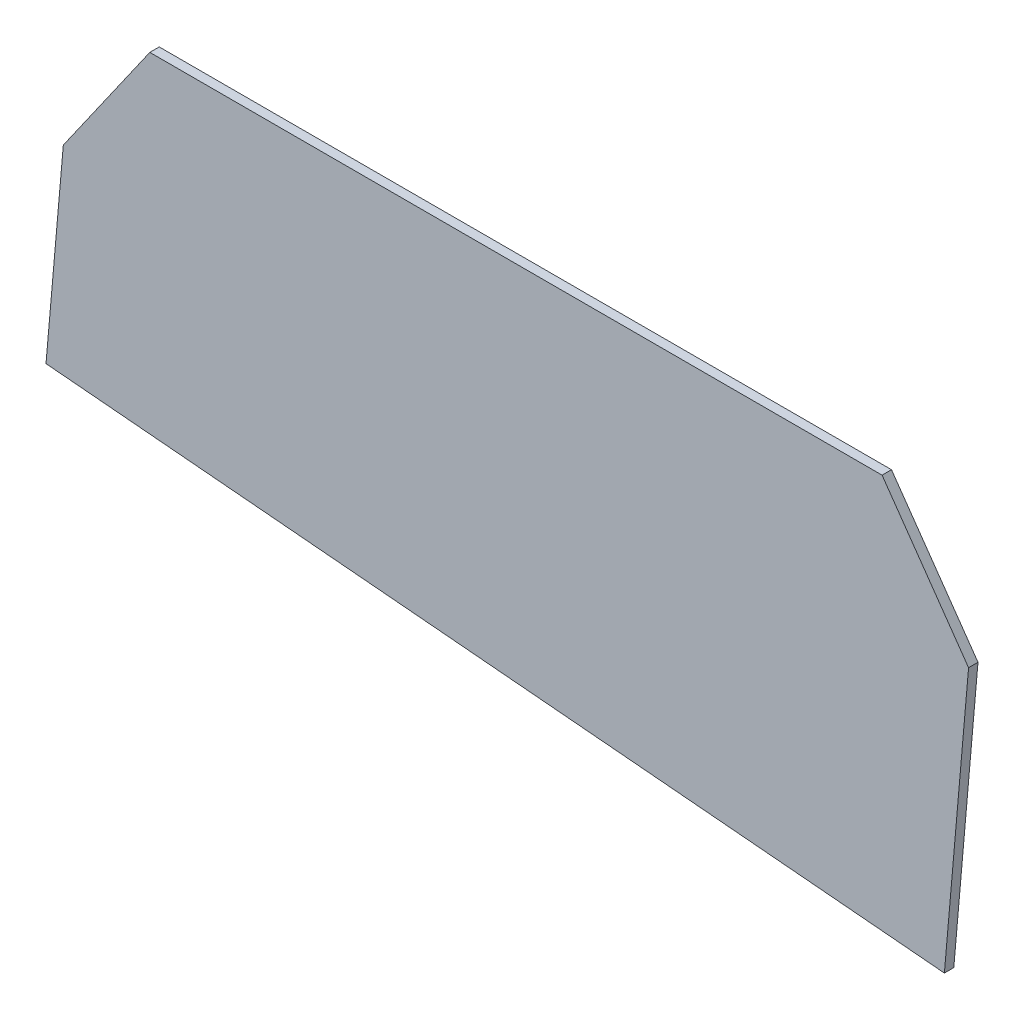
ISO-10303-21;
HEADER;
FILE_DESCRIPTION(('STEP AP214'),'2;1');
FILE_NAME('part.step','',(''),(''),'','','');
FILE_SCHEMA(('AUTOMOTIVE_DESIGN { 1 0 10303 214 1 1 1 1 }'));
ENDSEC;
DATA;
#1=APPLICATION_CONTEXT('core data for automotive mechanical design processes');
#2=APPLICATION_PROTOCOL_DEFINITION('international standard','automotive_design',2000,#1);
#3=PRODUCT_CONTEXT('',#1,'mechanical');
#4=PRODUCT('Part','Part','',(#3));
#5=PRODUCT_RELATED_PRODUCT_CATEGORY('part','',(#4));
#6=PRODUCT_DEFINITION_FORMATION('','',#4);
#7=PRODUCT_DEFINITION_CONTEXT('part definition',#1,'design');
#8=PRODUCT_DEFINITION('design','',#6,#7);
#9=PRODUCT_DEFINITION_SHAPE('','',#8);
#10=(LENGTH_UNIT() NAMED_UNIT(*) SI_UNIT(.MILLI.,.METRE.));
#11=(NAMED_UNIT(*) PLANE_ANGLE_UNIT() SI_UNIT($,.RADIAN.));
#12=(NAMED_UNIT(*) SI_UNIT($,.STERADIAN.) SOLID_ANGLE_UNIT());
#13=UNCERTAINTY_MEASURE_WITH_UNIT(LENGTH_MEASURE(1.E-05),#10,'distance_accuracy_value','');
#14=(GEOMETRIC_REPRESENTATION_CONTEXT(3) GLOBAL_UNCERTAINTY_ASSIGNED_CONTEXT((#13)) GLOBAL_UNIT_ASSIGNED_CONTEXT((#10,
#11,#12)) REPRESENTATION_CONTEXT('',''));
#15=CARTESIAN_POINT('',(0.,0.,0.));
#16=DIRECTION('',(0.,0.,1.));
#17=DIRECTION('',(1.,0.,0.));
#18=AXIS2_PLACEMENT_3D('',#15,#16,#17);
#19=CARTESIAN_POINT('',(-79.8500812574928,25.4000000000057,3.175));
#20=DIRECTION('',(0.,-1.,0.));
#21=DIRECTION('',(1.,0.,0.));
#22=AXIS2_PLACEMENT_3D('',#19,#20,#21);
#23=PLANE('',#22);
#24=DIRECTION('',(-1.,0.,0.));
#25=VECTOR('',#24,1.);
#26=CARTESIAN_POINT('',(-79.8500812574928,25.4000000000057,0.));
#27=LINE('',#26,#25);
#28=CARTESIAN_POINT('',(-79.8500812574928,25.4000000000057,0.));
#29=VERTEX_POINT('',#28);
#30=CARTESIAN_POINT('',(-326.549918742491,25.4000000000047,0.));
#31=VERTEX_POINT('',#30);
#32=EDGE_CURVE('E131',#29,#31,#27,.T.);
#33=ORIENTED_EDGE('',*,*,#32,.T.);
#34=DIRECTION('',(0.,0.,-1.));
#35=VECTOR('',#34,1.);
#36=CARTESIAN_POINT('',(-326.549918742491,25.4000000000047,3.175));
#37=LINE('',#36,#35);
#38=CARTESIAN_POINT('',(-326.549918742491,25.4000000000047,3.175));
#39=VERTEX_POINT('',#38);
#40=EDGE_CURVE('E11',#39,#31,#37,.T.);
#41=ORIENTED_EDGE('',*,*,#40,.F.);
#42=DIRECTION('',(-1.,0.,0.));
#43=VECTOR('',#42,1.);
#44=CARTESIAN_POINT('',(-79.8500812574928,25.4000000000057,3.175));
#45=LINE('',#44,#43);
#46=CARTESIAN_POINT('',(-79.8500812574928,25.4000000000057,3.175));
#47=VERTEX_POINT('',#46);
#48=EDGE_CURVE('E145',#47,#39,#45,.T.);
#49=ORIENTED_EDGE('',*,*,#48,.F.);
#50=DIRECTION('',(0.,0.,-1.));
#51=VECTOR('',#50,1.);
#52=CARTESIAN_POINT('',(-79.8500812574928,25.4000000000057,3.175));
#53=LINE('',#52,#51);
#54=EDGE_CURVE('E127',#47,#29,#53,.T.);
#55=ORIENTED_EDGE('',*,*,#54,.T.);
#56=EDGE_LOOP('',(#33,#41,#49,#55));
#57=FACE_BOUND('',#56,.T.);
#58=ADVANCED_FACE('F39',(#57),#23,.F.);
#59=CARTESIAN_POINT('',(-326.549918742491,25.4000000000047,3.175));
#60=DIRECTION('',(0.819152044288999,-0.573576436351036,0.));
#61=DIRECTION('',(0.573576436351036,0.819152044288999,0.));
#62=AXIS2_PLACEMENT_3D('',#59,#60,#61);
#63=PLANE('',#62);
#64=DIRECTION('',(-0.573576436351036,-0.819152044288999,0.));
#65=VECTOR('',#64,1.);
#66=CARTESIAN_POINT('',(-326.549918742491,25.4000000000047,0.));
#67=LINE('',#66,#65);
#68=CARTESIAN_POINT('',(-355.68760170912,-16.2129238498706,0.));
#69=VERTEX_POINT('',#68);
#70=EDGE_CURVE('E135',#31,#69,#67,.T.);
#71=ORIENTED_EDGE('',*,*,#70,.T.);
#72=DIRECTION('',(0.,0.,-1.));
#73=VECTOR('',#72,1.);
#74=CARTESIAN_POINT('',(-355.68760170912,-16.2129238498706,3.175));
#75=LINE('',#74,#73);
#76=CARTESIAN_POINT('',(-355.68760170912,-16.2129238498706,3.175));
#77=VERTEX_POINT('',#76);
#78=EDGE_CURVE('E48',#77,#69,#75,.T.);
#79=ORIENTED_EDGE('',*,*,#78,.F.);
#80=DIRECTION('',(-0.573576436351036,-0.819152044288999,0.));
#81=VECTOR('',#80,1.);
#82=CARTESIAN_POINT('',(-326.549918742491,25.4000000000047,3.175));
#83=LINE('',#82,#81);
#84=EDGE_CURVE('E97',#39,#77,#83,.T.);
#85=ORIENTED_EDGE('',*,*,#84,.F.);
#86=ORIENTED_EDGE('',*,*,#40,.T.);
#87=EDGE_LOOP('',(#71,#79,#85,#86));
#88=FACE_BOUND('',#87,.T.);
#89=ADVANCED_FACE('F171',(#88),#63,.F.);
#90=CARTESIAN_POINT('',(-355.68760170912,-16.2129238498706,3.175));
#91=DIRECTION('',(0.996194698091745,-0.0871557427476585,0.));
#92=DIRECTION('',(0.0871557427476585,0.996194698091746,0.));
#93=AXIS2_PLACEMENT_3D('',#90,#91,#92);
#94=PLANE('',#93);
#95=DIRECTION('',(-0.0871557427476585,-0.996194698091746,0.));
#96=VECTOR('',#95,1.);
#97=CARTESIAN_POINT('',(-355.68760170912,-16.2129238498706,0.));
#98=LINE('',#97,#96);
#99=CARTESIAN_POINT('',(-361.522202614989,-82.9027173696994,0.));
#100=VERTEX_POINT('',#99);
#101=EDGE_CURVE('E138',#69,#100,#98,.T.);
#102=ORIENTED_EDGE('',*,*,#101,.T.);
#103=DIRECTION('',(0.,0.,-1.));
#104=VECTOR('',#103,1.);
#105=CARTESIAN_POINT('',(-361.522202614989,-82.9027173696994,3.175));
#106=LINE('',#105,#104);
#107=CARTESIAN_POINT('',(-361.522202614989,-82.9027173696994,3.175));
#108=VERTEX_POINT('',#107);
#109=EDGE_CURVE('E122',#108,#100,#106,.T.);
#110=ORIENTED_EDGE('',*,*,#109,.F.);
#111=DIRECTION('',(-0.0871557427476585,-0.996194698091746,0.));
#112=VECTOR('',#111,1.);
#113=CARTESIAN_POINT('',(-355.68760170912,-16.2129238498706,3.175));
#114=LINE('',#113,#112);
#115=EDGE_CURVE('E112',#77,#108,#114,.T.);
#116=ORIENTED_EDGE('',*,*,#115,.F.);
#117=ORIENTED_EDGE('',*,*,#78,.T.);
#118=EDGE_LOOP('',(#102,#110,#116,#117));
#119=FACE_BOUND('',#118,.T.);
#120=ADVANCED_FACE('F153',(#119),#94,.F.);
#121=CARTESIAN_POINT('',(-361.522202614989,-82.9027173696994,3.175));
#122=DIRECTION('',(0.0871557427476586,0.996194698091746,0.));
#123=DIRECTION('',(-0.996194698091746,0.0871557427476586,0.));
#124=AXIS2_PLACEMENT_3D('',#121,#122,#123);
#125=PLANE('',#124);
#126=DIRECTION('',(0.996194698091745,-0.0871557427476586,0.));
#127=VECTOR('',#126,1.);
#128=CARTESIAN_POINT('',(-361.522202614989,-82.9027173696994,0.));
#129=LINE('',#128,#127);
#130=CARTESIAN_POINT('',(-58.8636285044702,-109.381911523291,0.));
#131=VERTEX_POINT('',#130);
#132=EDGE_CURVE('E121',#100,#131,#129,.T.);
#133=ORIENTED_EDGE('',*,*,#132,.T.);
#134=DIRECTION('',(0.,0.,-1.));
#135=VECTOR('',#134,1.);
#136=CARTESIAN_POINT('',(-58.8636285044702,-109.381911523291,3.175));
#137=LINE('',#136,#135);
#138=CARTESIAN_POINT('',(-58.8636285044702,-109.381911523291,3.175));
#139=VERTEX_POINT('',#138);
#140=EDGE_CURVE('E118',#139,#131,#137,.T.);
#141=ORIENTED_EDGE('',*,*,#140,.F.);
#142=DIRECTION('',(0.996194698091745,-0.0871557427476586,0.));
#143=VECTOR('',#142,1.);
#144=CARTESIAN_POINT('',(-361.522202614989,-82.9027173696994,3.175));
#145=LINE('',#144,#143);
#146=EDGE_CURVE('E106',#108,#139,#145,.T.);
#147=ORIENTED_EDGE('',*,*,#146,.F.);
#148=ORIENTED_EDGE('',*,*,#109,.T.);
#149=EDGE_LOOP('',(#133,#141,#147,#148));
#150=FACE_BOUND('',#149,.T.);
#151=ADVANCED_FACE('F119',(#150),#125,.F.);
#152=CARTESIAN_POINT('',(-50.7123982908597,-16.2129238498745,3.175));
#153=DIRECTION('',(-0.996194698091745,0.0871557427476587,0.));
#154=DIRECTION('',(-0.0871557427476587,-0.996194698091746,0.));
#155=AXIS2_PLACEMENT_3D('',#152,#153,#154);
#156=PLANE('',#155);
#157=DIRECTION('',(0.0871557427476587,0.996194698091746,0.));
#158=VECTOR('',#157,1.);
#159=CARTESIAN_POINT('',(-50.7123982908597,-16.2129238498745,0.));
#160=LINE('',#159,#158);
#161=CARTESIAN_POINT('',(-50.7123982908597,-16.2129238498745,0.));
#162=VERTEX_POINT('',#161);
#163=EDGE_CURVE('E82',#131,#162,#160,.T.);
#164=ORIENTED_EDGE('',*,*,#163,.T.);
#165=DIRECTION('',(0.,0.,-1.));
#166=VECTOR('',#165,1.);
#167=CARTESIAN_POINT('',(-50.7123982908597,-16.2129238498745,3.175));
#168=LINE('',#167,#166);
#169=CARTESIAN_POINT('',(-50.7123982908597,-16.2129238498745,3.175));
#170=VERTEX_POINT('',#169);
#171=EDGE_CURVE('E123',#170,#162,#168,.T.);
#172=ORIENTED_EDGE('',*,*,#171,.F.);
#173=DIRECTION('',(0.0871557427476587,0.996194698091746,0.));
#174=VECTOR('',#173,1.);
#175=CARTESIAN_POINT('',(-50.7123982908597,-16.2129238498745,3.175));
#176=LINE('',#175,#174);
#177=EDGE_CURVE('E110',#139,#170,#176,.T.);
#178=ORIENTED_EDGE('',*,*,#177,.F.);
#179=ORIENTED_EDGE('',*,*,#140,.T.);
#180=EDGE_LOOP('',(#164,#172,#178,#179));
#181=FACE_BOUND('',#180,.T.);
#182=ADVANCED_FACE('F125',(#181),#156,.F.);
#183=CARTESIAN_POINT('',(-79.8500812574928,25.4000000000057,3.175));
#184=DIRECTION('',(-0.819152044288989,-0.57357643635105,0.));
#185=DIRECTION('',(0.573576436351051,-0.819152044288989,0.));
#186=AXIS2_PLACEMENT_3D('',#183,#184,#185);
#187=PLANE('',#186);
#188=DIRECTION('',(-0.57357643635105,0.819152044288989,0.));
#189=VECTOR('',#188,1.);
#190=CARTESIAN_POINT('',(-79.8500812574928,25.4000000000057,0.));
#191=LINE('',#190,#189);
#192=EDGE_CURVE('E88',#162,#29,#191,.T.);
#193=ORIENTED_EDGE('',*,*,#192,.T.);
#194=ORIENTED_EDGE('',*,*,#54,.F.);
#195=DIRECTION('',(-0.57357643635105,0.819152044288989,0.));
#196=VECTOR('',#195,1.);
#197=CARTESIAN_POINT('',(-79.8500812574928,25.4000000000057,3.175));
#198=LINE('',#197,#196);
#199=EDGE_CURVE('E56',#170,#47,#198,.T.);
#200=ORIENTED_EDGE('',*,*,#199,.F.);
#201=ORIENTED_EDGE('',*,*,#171,.T.);
#202=EDGE_LOOP('',(#193,#194,#200,#201));
#203=FACE_BOUND('',#202,.T.);
#204=ADVANCED_FACE('F160',(#203),#187,.F.);
#205=CARTESIAN_POINT('',(0.,0.,3.175));
#206=DIRECTION('',(0.,0.,1.));
#207=DIRECTION('',(1.,0.,0.));
#208=AXIS2_PLACEMENT_3D('',#205,#206,#207);
#209=PLANE('',#208);
#210=ORIENTED_EDGE('',*,*,#48,.T.);
#211=ORIENTED_EDGE('',*,*,#84,.T.);
#212=ORIENTED_EDGE('',*,*,#115,.T.);
#213=ORIENTED_EDGE('',*,*,#146,.T.);
#214=ORIENTED_EDGE('',*,*,#177,.T.);
#215=ORIENTED_EDGE('',*,*,#199,.T.);
#216=EDGE_LOOP('',(#210,#211,#212,#213,#214,#215));
#217=FACE_BOUND('',#216,.T.);
#218=ADVANCED_FACE('F108',(#217),#209,.T.);
#219=CARTESIAN_POINT('',(0.,0.,0.));
#220=DIRECTION('',(0.,0.,1.));
#221=DIRECTION('',(1.,0.,0.));
#222=AXIS2_PLACEMENT_3D('',#219,#220,#221);
#223=PLANE('',#222);
#224=ORIENTED_EDGE('',*,*,#32,.F.);
#225=ORIENTED_EDGE('',*,*,#192,.F.);
#226=ORIENTED_EDGE('',*,*,#163,.F.);
#227=ORIENTED_EDGE('',*,*,#132,.F.);
#228=ORIENTED_EDGE('',*,*,#101,.F.);
#229=ORIENTED_EDGE('',*,*,#70,.F.);
#230=EDGE_LOOP('',(#224,#225,#226,#227,#228,#229));
#231=FACE_BOUND('',#230,.T.);
#232=ADVANCED_FACE('F156',(#231),#223,.F.);
#233=CLOSED_SHELL('',(#58,#89,#120,#151,#182,#204,#218,#232));
#234=MANIFOLD_SOLID_BREP('B2',#233);
#235=ADVANCED_BREP_SHAPE_REPRESENTATION('',(#18,#234),#14);
#236=SHAPE_DEFINITION_REPRESENTATION(#9,#235);
ENDSEC;
END-ISO-10303-21;
